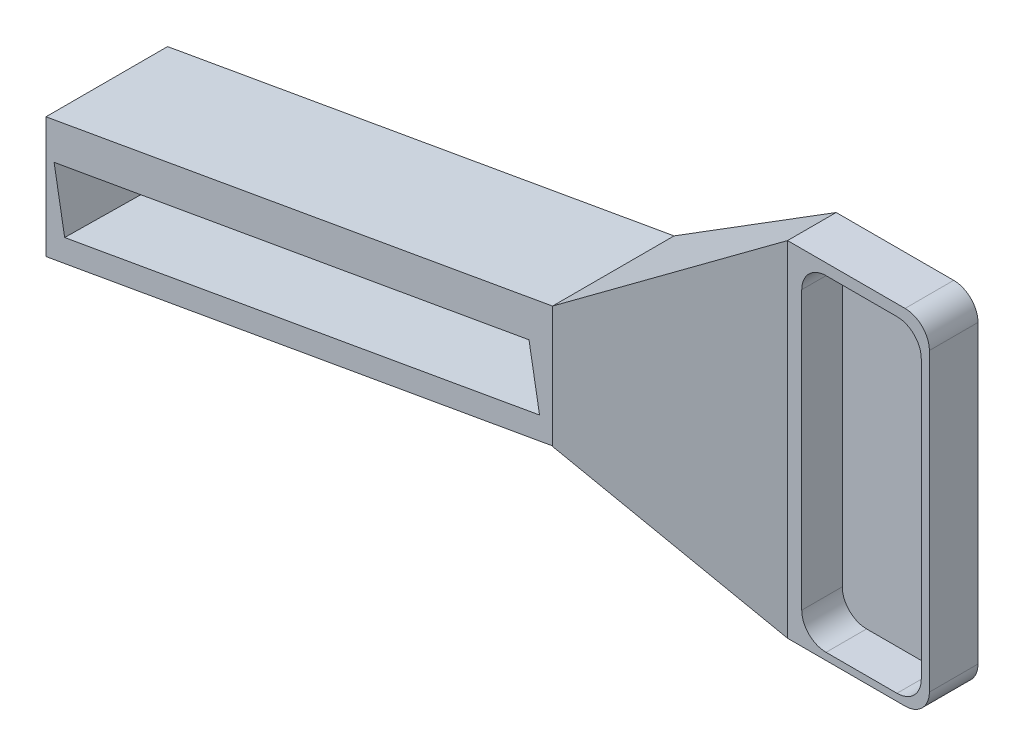
ISO-10303-21;
HEADER;
FILE_DESCRIPTION(('STEP AP214'),'2;1');
FILE_NAME('part.step','',(''),(''),'','','');
FILE_SCHEMA(('AUTOMOTIVE_DESIGN { 1 0 10303 214 1 1 1 1 }'));
ENDSEC;
DATA;
#1=APPLICATION_CONTEXT('core data for automotive mechanical design processes');
#2=APPLICATION_PROTOCOL_DEFINITION('international standard','automotive_design',2000,#1);
#3=PRODUCT_CONTEXT('',#1,'mechanical');
#4=PRODUCT('Part','Part','',(#3));
#5=PRODUCT_RELATED_PRODUCT_CATEGORY('part','',(#4));
#6=PRODUCT_DEFINITION_FORMATION('','',#4);
#7=PRODUCT_DEFINITION_CONTEXT('part definition',#1,'design');
#8=PRODUCT_DEFINITION('design','',#6,#7);
#9=PRODUCT_DEFINITION_SHAPE('','',#8);
#10=(LENGTH_UNIT() NAMED_UNIT(*) SI_UNIT(.MILLI.,.METRE.));
#11=(NAMED_UNIT(*) PLANE_ANGLE_UNIT() SI_UNIT($,.RADIAN.));
#12=(NAMED_UNIT(*) SI_UNIT($,.STERADIAN.) SOLID_ANGLE_UNIT());
#13=UNCERTAINTY_MEASURE_WITH_UNIT(LENGTH_MEASURE(1.E-05),#10,'distance_accuracy_value','');
#14=(GEOMETRIC_REPRESENTATION_CONTEXT(3) GLOBAL_UNCERTAINTY_ASSIGNED_CONTEXT((#13)) GLOBAL_UNIT_ASSIGNED_CONTEXT((#10,
#11,#12)) REPRESENTATION_CONTEXT('',''));
#15=CARTESIAN_POINT('',(0.,0.,0.));
#16=DIRECTION('',(0.,0.,1.));
#17=DIRECTION('',(1.,0.,0.));
#18=AXIS2_PLACEMENT_3D('',#15,#16,#17);
#19=CARTESIAN_POINT('',(0.,85.,30.));
#20=DIRECTION('',(0.,0.,-1.));
#21=DIRECTION('',(-1.,0.,0.));
#22=AXIS2_PLACEMENT_3D('',#19,#20,#21);
#23=PLANE('',#22);
#24=DIRECTION('',(0.173648177666931,-0.984807753012208,0.));
#25=VECTOR('',#24,1.);
#26=CARTESIAN_POINT('',(148.645542453034,-117.152586342547,30.));
#27=LINE('',#26,#25);
#28=CARTESIAN_POINT('',(119.192122608453,49.8860581475916,30.));
#29=VERTEX_POINT('',#28);
#30=CARTESIAN_POINT('',(121.796845273457,35.1139418524085,30.));
#31=VERTEX_POINT('',#30);
#32=EDGE_CURVE('E374',#29,#31,#27,.T.);
#33=ORIENTED_EDGE('',*,*,#32,.T.);
#34=DIRECTION('',(0.984807753012208,0.173648177666931,0.));
#35=VECTOR('',#34,1.);
#36=CARTESIAN_POINT('',(73.151302820423,26.5364202267395,30.));
#37=LINE('',#36,#35);
#38=CARTESIAN_POINT('',(4.60472266500394,14.4498087100436,30.));
#39=VERTEX_POINT('',#38);
#40=EDGE_CURVE('E382',#39,#31,#37,.T.);
#41=ORIENTED_EDGE('',*,*,#40,.F.);
#42=DIRECTION('',(0.173648177666931,-0.984807753012208,0.));
#43=VECTOR('',#42,1.);
#44=CARTESIAN_POINT('',(31.4534198445809,-137.816719484912,30.));
#45=LINE('',#44,#43);
#46=CARTESIAN_POINT('',(1.99999999999997,29.2219250052268,30.));
#47=VERTEX_POINT('',#46);
#48=EDGE_CURVE('E380',#47,#39,#45,.T.);
#49=ORIENTED_EDGE('',*,*,#48,.F.);
#50=DIRECTION('',(0.984807753012208,0.173648177666931,0.));
#51=VECTOR('',#50,1.);
#52=CARTESIAN_POINT('',(70.5465801554191,41.3085365219227,30.));
#53=LINE('',#52,#51);
#54=EDGE_CURVE('E377',#47,#29,#53,.T.);
#55=ORIENTED_EDGE('',*,*,#54,.T.);
#56=EDGE_LOOP('',(#33,#41,#49,#55));
#57=FACE_BOUND('',#56,.T.);
#58=DIRECTION('',(0.984807753012208,0.173648177666931,0.));
#59=VECTOR('',#58,1.);
#60=CARTESIAN_POINT('',(45.8978941203874,16.166106354975,30.));
#61=LINE('',#60,#59);
#62=CARTESIAN_POINT('',(0.,8.07306926385028,30.));
#63=VERTEX_POINT('',#62);
#64=CARTESIAN_POINT('',(125.,30.1139418524085,30.));
#65=VERTEX_POINT('',#64);
#66=EDGE_CURVE('E309',#63,#65,#61,.T.);
#67=ORIENTED_EDGE('',*,*,#66,.T.);
#68=DIRECTION('',(0.,1.,0.));
#69=VECTOR('',#68,1.);
#70=CARTESIAN_POINT('',(125.,85.,30.));
#71=LINE('',#70,#69);
#72=CARTESIAN_POINT('',(125.,60.,30.));
#73=VERTEX_POINT('',#72);
#74=EDGE_CURVE('E393',#65,#73,#71,.T.);
#75=ORIENTED_EDGE('',*,*,#74,.T.);
#76=DIRECTION('',(-0.984807753012207,-0.173648177666938,0.));
#77=VECTOR('',#76,1.);
#78=CARTESIAN_POINT('',(41.2609670724875,45.2345491564444,30.));
#79=LINE('',#78,#77);
#80=CARTESIAN_POINT('',(0.,37.9591274114409,30.));
#81=VERTEX_POINT('',#80);
#82=EDGE_CURVE('E327',#73,#81,#79,.T.);
#83=ORIENTED_EDGE('',*,*,#82,.T.);
#84=DIRECTION('',(0.,-1.,0.));
#85=VECTOR('',#84,1.);
#86=CARTESIAN_POINT('',(0.,0.,30.));
#87=LINE('',#86,#85);
#88=EDGE_CURVE('E390',#81,#63,#87,.T.);
#89=ORIENTED_EDGE('',*,*,#88,.T.);
#90=EDGE_LOOP('',(#67,#75,#83,#89));
#91=FACE_BOUND('',#90,.T.);
#92=ADVANCED_FACE('F35',(#57,#91),#23,.F.);
#93=CARTESIAN_POINT('',(0.,0.,30.));
#94=DIRECTION('',(1.,0.,0.));
#95=DIRECTION('',(0.,0.,-1.));
#96=AXIS2_PLACEMENT_3D('',#93,#94,#95);
#97=PLANE('',#96);
#98=DIRECTION('',(0.,0.,1.));
#99=VECTOR('',#98,1.);
#100=CARTESIAN_POINT('',(0.,8.07306926385028,0.));
#101=LINE('',#100,#99);
#102=CARTESIAN_POINT('',(0.,8.07306926385028,0.));
#103=VERTEX_POINT('',#102);
#104=EDGE_CURVE('E321',#103,#63,#101,.T.);
#105=ORIENTED_EDGE('',*,*,#104,.T.);
#106=ORIENTED_EDGE('',*,*,#88,.F.);
#107=DIRECTION('',(0.,0.,1.));
#108=VECTOR('',#107,1.);
#109=CARTESIAN_POINT('',(0.,37.9591274114409,0.));
#110=LINE('',#109,#108);
#111=CARTESIAN_POINT('',(0.,37.9591274114409,0.));
#112=VERTEX_POINT('',#111);
#113=EDGE_CURVE('E335',#112,#81,#110,.T.);
#114=ORIENTED_EDGE('',*,*,#113,.F.);
#115=DIRECTION('',(0.,-1.,0.));
#116=VECTOR('',#115,1.);
#117=CARTESIAN_POINT('',(0.,0.,0.));
#118=LINE('',#117,#116);
#119=EDGE_CURVE('E388',#112,#103,#118,.T.);
#120=ORIENTED_EDGE('',*,*,#119,.T.);
#121=EDGE_LOOP('',(#105,#106,#114,#120));
#122=FACE_BOUND('',#121,.T.);
#123=ADVANCED_FACE('F515',(#122),#97,.F.);
#124=CARTESIAN_POINT('',(0.,85.,0.));
#125=DIRECTION('',(0.,0.,-1.));
#126=DIRECTION('',(-1.,0.,0.));
#127=AXIS2_PLACEMENT_3D('',#124,#125,#126);
#128=PLANE('',#127);
#129=DIRECTION('',(-0.173648177666932,0.984807753012208,0.));
#130=VECTOR('',#129,1.);
#131=CARTESIAN_POINT('',(4.99999999999999,10.9855573911641,0.));
#132=LINE('',#131,#130);
#133=CARTESIAN_POINT('',(4.99999999999999,10.9855573911641,0.));
#134=VERTEX_POINT('',#133);
#135=CARTESIAN_POINT('',(4.65270364466613,12.9551728971885,0.));
#136=VERTEX_POINT('',#135);
#137=EDGE_CURVE('E246',#134,#136,#132,.T.);
#138=ORIENTED_EDGE('',*,*,#137,.F.);
#139=DIRECTION('',(-0.984807753012208,-0.173648177666931,0.));
#140=VECTOR('',#139,1.);
#141=CARTESIAN_POINT('',(4.99999999999999,10.9855573911641,0.));
#142=LINE('',#141,#140);
#143=CARTESIAN_POINT('',(44.3923101204883,17.9314844978413,0.));
#144=VERTEX_POINT('',#143);
#145=EDGE_CURVE('E266',#144,#134,#142,.T.);
#146=ORIENTED_EDGE('',*,*,#145,.F.);
#147=DIRECTION('',(0.173648177666932,-0.984807753012208,0.));
#148=VECTOR('',#147,1.);
#149=CARTESIAN_POINT('',(44.3923101204883,17.9314844978413,0.));
#150=LINE('',#149,#148);
#151=CARTESIAN_POINT('',(44.0450137651545,19.9011000038658,0.));
#152=VERTEX_POINT('',#151);
#153=EDGE_CURVE('E269',#152,#144,#150,.T.);
#154=ORIENTED_EDGE('',*,*,#153,.F.);
#155=DIRECTION('',(0.984807753012208,0.173648177666931,0.));
#156=VECTOR('',#155,1.);
#157=CARTESIAN_POINT('',(4.65270364466613,12.9551728971885,0.));
#158=LINE('',#157,#156);
#159=EDGE_CURVE('E275',#136,#152,#158,.T.);
#160=ORIENTED_EDGE('',*,*,#159,.F.);
#161=EDGE_LOOP('',(#138,#146,#154,#160));
#162=FACE_BOUND('',#161,.T.);
#163=DIRECTION('',(-1.,0.,0.));
#164=VECTOR('',#163,1.);
#165=CARTESIAN_POINT('',(0.,85.,0.));
#166=LINE('',#165,#164);
#167=CARTESIAN_POINT('',(194.,85.,0.));
#168=VERTEX_POINT('',#167);
#169=CARTESIAN_POINT('',(165.,85.,0.));
#170=VERTEX_POINT('',#169);
#171=EDGE_CURVE('E394',#168,#170,#166,.T.);
#172=ORIENTED_EDGE('',*,*,#171,.F.);
#173=CARTESIAN_POINT('',(194.,79.,0.));
#174=DIRECTION('',(0.,0.,-1.));
#175=DIRECTION('',(-1.,0.,0.));
#176=AXIS2_PLACEMENT_3D('',#173,#174,#175);
#177=CIRCLE('',#176,6.);
#178=CARTESIAN_POINT('',(200.,79.,0.));
#179=VERTEX_POINT('',#178);
#180=EDGE_CURVE('E464',#168,#179,#177,.T.);
#181=ORIENTED_EDGE('',*,*,#180,.T.);
#182=DIRECTION('',(0.,1.,0.));
#183=VECTOR('',#182,1.);
#184=CARTESIAN_POINT('',(200.,0.,0.));
#185=LINE('',#184,#183);
#186=CARTESIAN_POINT('',(200.,6.,0.));
#187=VERTEX_POINT('',#186);
#188=EDGE_CURVE('E400',#187,#179,#185,.T.);
#189=ORIENTED_EDGE('',*,*,#188,.F.);
#190=CARTESIAN_POINT('',(194.,6.,0.));
#191=DIRECTION('',(0.,0.,-1.));
#192=DIRECTION('',(-1.,0.,0.));
#193=AXIS2_PLACEMENT_3D('',#190,#191,#192);
#194=CIRCLE('',#193,6.);
#195=CARTESIAN_POINT('',(194.,0.,0.));
#196=VERTEX_POINT('',#195);
#197=EDGE_CURVE('E462',#187,#196,#194,.T.);
#198=ORIENTED_EDGE('',*,*,#197,.T.);
#199=DIRECTION('',(1.,0.,0.));
#200=VECTOR('',#199,1.);
#201=CARTESIAN_POINT('',(0.,0.,0.));
#202=LINE('',#201,#200);
#203=CARTESIAN_POINT('',(165.,0.,0.));
#204=VERTEX_POINT('',#203);
#205=EDGE_CURVE('E397',#204,#196,#202,.T.);
#206=ORIENTED_EDGE('',*,*,#205,.F.);
#207=DIRECTION('',(0.8,-0.6,0.));
#208=VECTOR('',#207,1.);
#209=CARTESIAN_POINT('',(18.5999999999999,109.8,0.));
#210=LINE('',#209,#208);
#211=CARTESIAN_POINT('',(125.,30.,0.));
#212=VERTEX_POINT('',#211);
#213=EDGE_CURVE('E413',#204,#212,#210,.F.);
#214=ORIENTED_EDGE('',*,*,#213,.T.);
#215=DIRECTION('',(0.,1.,0.));
#216=VECTOR('',#215,1.);
#217=CARTESIAN_POINT('',(125.,-77.9891148874388,0.));
#218=LINE('',#217,#216);
#219=CARTESIAN_POINT('',(125.,30.1139418524085,0.));
#220=VERTEX_POINT('',#219);
#221=EDGE_CURVE('E319',#212,#220,#218,.T.);
#222=ORIENTED_EDGE('',*,*,#221,.T.);
#223=DIRECTION('',(0.984807753012208,0.173648177666931,0.));
#224=VECTOR('',#223,1.);
#225=CARTESIAN_POINT('',(45.8978941203874,16.166106354975,0.));
#226=LINE('',#225,#224);
#227=EDGE_CURVE('E316',#103,#220,#226,.T.);
#228=ORIENTED_EDGE('',*,*,#227,.F.);
#229=ORIENTED_EDGE('',*,*,#119,.F.);
#230=DIRECTION('',(-0.984807753012207,-0.173648177666938,0.));
#231=VECTOR('',#230,1.);
#232=CARTESIAN_POINT('',(41.2609670724875,45.2345491564444,0.));
#233=LINE('',#232,#231);
#234=CARTESIAN_POINT('',(125.,60.,0.));
#235=VERTEX_POINT('',#234);
#236=EDGE_CURVE('E330',#235,#112,#233,.T.);
#237=ORIENTED_EDGE('',*,*,#236,.F.);
#238=DIRECTION('',(-0.847998304005088,-0.52999894000318,0.));
#239=VECTOR('',#238,1.);
#240=CARTESIAN_POINT('',(46.3483146067415,10.8426966292136,0.));
#241=LINE('',#240,#239);
#242=EDGE_CURVE('E420',#235,#170,#241,.F.);
#243=ORIENTED_EDGE('',*,*,#242,.T.);
#244=EDGE_LOOP('',(#172,#181,#189,#198,#206,#214,#222,#228,#229,#237,#243));
#245=FACE_BOUND('',#244,.T.);
#246=ADVANCED_FACE('F519',(#162,#245),#128,.T.);
#247=CARTESIAN_POINT('',(0.,0.,30.));
#248=DIRECTION('',(0.,1.,0.));
#249=DIRECTION('',(0.,0.,1.));
#250=AXIS2_PLACEMENT_3D('',#247,#248,#249);
#251=PLANE('',#250);
#252=ORIENTED_EDGE('',*,*,#205,.T.);
#253=DIRECTION('',(0.,0.,-1.));
#254=VECTOR('',#253,1.);
#255=CARTESIAN_POINT('',(194.,0.,30.));
#256=LINE('',#255,#254);
#257=CARTESIAN_POINT('',(194.,0.,12.));
#258=VERTEX_POINT('',#257);
#259=EDGE_CURVE('E475',#196,#258,#256,.F.);
#260=ORIENTED_EDGE('',*,*,#259,.T.);
#261=DIRECTION('',(1.,0.,0.));
#262=VECTOR('',#261,1.);
#263=CARTESIAN_POINT('',(200.,0.,12.));
#264=LINE('',#263,#262);
#265=CARTESIAN_POINT('',(165.,0.,12.));
#266=VERTEX_POINT('',#265);
#267=EDGE_CURVE('E371',#266,#258,#264,.T.);
#268=ORIENTED_EDGE('',*,*,#267,.F.);
#269=DIRECTION('',(0.,0.,-1.));
#270=VECTOR('',#269,1.);
#271=CARTESIAN_POINT('',(165.,0.,30.));
#272=LINE('',#271,#270);
#273=EDGE_CURVE('E411',#266,#204,#272,.T.);
#274=ORIENTED_EDGE('',*,*,#273,.T.);
#275=EDGE_LOOP('',(#252,#260,#268,#274));
#276=FACE_BOUND('',#275,.T.);
#277=ADVANCED_FACE('F524',(#276),#251,.F.);
#278=CARTESIAN_POINT('',(200.,0.,30.));
#279=DIRECTION('',(-1.,0.,0.));
#280=DIRECTION('',(0.,0.,1.));
#281=AXIS2_PLACEMENT_3D('',#278,#279,#280);
#282=PLANE('',#281);
#283=ORIENTED_EDGE('',*,*,#188,.T.);
#284=DIRECTION('',(0.,0.,-1.));
#285=VECTOR('',#284,1.);
#286=CARTESIAN_POINT('',(200.,79.,30.));
#287=LINE('',#286,#285);
#288=CARTESIAN_POINT('',(200.,79.,12.));
#289=VERTEX_POINT('',#288);
#290=EDGE_CURVE('E469',#179,#289,#287,.F.);
#291=ORIENTED_EDGE('',*,*,#290,.T.);
#292=DIRECTION('',(0.,1.,0.));
#293=VECTOR('',#292,1.);
#294=CARTESIAN_POINT('',(200.,85.,12.));
#295=LINE('',#294,#293);
#296=CARTESIAN_POINT('',(200.,6.00000000000001,12.));
#297=VERTEX_POINT('',#296);
#298=EDGE_CURVE('E353',#297,#289,#295,.T.);
#299=ORIENTED_EDGE('',*,*,#298,.F.);
#300=DIRECTION('',(0.,0.,-1.));
#301=VECTOR('',#300,1.);
#302=CARTESIAN_POINT('',(200.,6.,30.));
#303=LINE('',#302,#301);
#304=EDGE_CURVE('E466',#297,#187,#303,.T.);
#305=ORIENTED_EDGE('',*,*,#304,.T.);
#306=EDGE_LOOP('',(#283,#291,#299,#305));
#307=FACE_BOUND('',#306,.T.);
#308=ADVANCED_FACE('F509',(#307),#282,.F.);
#309=CARTESIAN_POINT('',(0.,85.,30.));
#310=DIRECTION('',(0.,-1.,0.));
#311=DIRECTION('',(0.,0.,-1.));
#312=AXIS2_PLACEMENT_3D('',#309,#310,#311);
#313=PLANE('',#312);
#314=DIRECTION('',(-1.,0.,0.));
#315=VECTOR('',#314,1.);
#316=CARTESIAN_POINT('',(200.,85.,12.));
#317=LINE('',#316,#315);
#318=CARTESIAN_POINT('',(194.,85.,12.));
#319=VERTEX_POINT('',#318);
#320=CARTESIAN_POINT('',(165.,85.,12.));
#321=VERTEX_POINT('',#320);
#322=EDGE_CURVE('E366',#319,#321,#317,.T.);
#323=ORIENTED_EDGE('',*,*,#322,.F.);
#324=DIRECTION('',(0.,0.,-1.));
#325=VECTOR('',#324,1.);
#326=CARTESIAN_POINT('',(194.,85.,30.));
#327=LINE('',#326,#325);
#328=EDGE_CURVE('E459',#319,#168,#327,.T.);
#329=ORIENTED_EDGE('',*,*,#328,.T.);
#330=ORIENTED_EDGE('',*,*,#171,.T.);
#331=DIRECTION('',(0.,0.,1.));
#332=VECTOR('',#331,1.);
#333=CARTESIAN_POINT('',(165.,85.,30.));
#334=LINE('',#333,#332);
#335=EDGE_CURVE('E415',#170,#321,#334,.T.);
#336=ORIENTED_EDGE('',*,*,#335,.T.);
#337=EDGE_LOOP('',(#323,#329,#330,#336));
#338=FACE_BOUND('',#337,.T.);
#339=ADVANCED_FACE('F502',(#338),#313,.F.);
#340=CARTESIAN_POINT('',(148.645542453034,-117.152586342547,2.));
#341=DIRECTION('',(-0.984807753012208,-0.173648177666931,0.));
#342=DIRECTION('',(0.173648177666931,-0.984807753012208,0.));
#343=AXIS2_PLACEMENT_3D('',#340,#341,#342);
#344=PLANE('',#343);
#345=DIRECTION('',(0.,0.,1.));
#346=VECTOR('',#345,1.);
#347=CARTESIAN_POINT('',(119.192122608453,49.8860581475916,2.));
#348=LINE('',#347,#346);
#349=CARTESIAN_POINT('',(119.192122608453,49.8860581475916,4.));
#350=VERTEX_POINT('',#349);
#351=EDGE_CURVE('E385',#350,#29,#348,.T.);
#352=ORIENTED_EDGE('',*,*,#351,.F.);
#353=DIRECTION('',(0.173648177666931,-0.984807753012208,0.));
#354=VECTOR('',#353,1.);
#355=CARTESIAN_POINT('',(121.796845273457,35.1139418524085,4.));
#356=LINE('',#355,#354);
#357=CARTESIAN_POINT('',(121.796845273457,35.1139418524085,4.));
#358=VERTEX_POINT('',#357);
#359=EDGE_CURVE('E477',#350,#358,#356,.T.);
#360=ORIENTED_EDGE('',*,*,#359,.T.);
#361=DIRECTION('',(0.,0.,1.));
#362=VECTOR('',#361,1.);
#363=CARTESIAN_POINT('',(121.796845273457,35.1139418524085,2.));
#364=LINE('',#363,#362);
#365=EDGE_CURVE('E386',#358,#31,#364,.T.);
#366=ORIENTED_EDGE('',*,*,#365,.T.);
#367=ORIENTED_EDGE('',*,*,#32,.F.);
#368=EDGE_LOOP('',(#352,#360,#366,#367));
#369=FACE_BOUND('',#368,.T.);
#370=ADVANCED_FACE('F500',(#369),#344,.T.);
#371=CARTESIAN_POINT('',(73.151302820423,26.5364202267395,2.));
#372=DIRECTION('',(0.173648177666931,-0.984807753012208,0.));
#373=DIRECTION('',(0.984807753012208,0.173648177666931,0.));
#374=AXIS2_PLACEMENT_3D('',#371,#372,#373);
#375=PLANE('',#374);
#376=DIRECTION('',(0.98466869515314,0.173623658014498,0.0168043495285633));
#377=VECTOR('',#376,1.);
#378=CARTESIAN_POINT('',(121.796845273457,35.1139418524085,4.));
#379=LINE('',#378,#377);
#380=CARTESIAN_POINT('',(5.06751695172591,14.5314118293105,2.00789804427801));
#381=VERTEX_POINT('',#380);
#382=EDGE_CURVE('E480',#358,#381,#379,.F.);
#383=ORIENTED_EDGE('',*,*,#382,.T.);
#384=DIRECTION('',(-0.0165307015655505,-0.00291480869604622,0.999859109973008));
#385=VECTOR('',#384,1.);
#386=CARTESIAN_POINT('',(5.0675169517259,14.5314118293105,2.00789804427801));
#387=LINE('',#386,#385);
#388=EDGE_CURVE('E43',#381,#39,#387,.T.);
#389=ORIENTED_EDGE('',*,*,#388,.T.);
#390=ORIENTED_EDGE('',*,*,#40,.T.);
#391=ORIENTED_EDGE('',*,*,#365,.F.);
#392=EDGE_LOOP('',(#383,#389,#390,#391));
#393=FACE_BOUND('',#392,.T.);
#394=ADVANCED_FACE('F488',(#393),#375,.F.);
#395=CARTESIAN_POINT('',(70.5465801554191,41.3085365219227,2.));
#396=DIRECTION('',(0.173648177666931,-0.984807753012208,0.));
#397=DIRECTION('',(0.984807753012208,0.173648177666931,0.));
#398=AXIS2_PLACEMENT_3D('',#395,#396,#397);
#399=PLANE('',#398);
#400=ORIENTED_EDGE('',*,*,#54,.F.);
#401=DIRECTION('',(0.0165307015655505,0.00291480869604622,-0.999859109973008));
#402=VECTOR('',#401,1.);
#403=CARTESIAN_POINT('',(2.48210812993455,29.3069336761532,0.839700674785365));
#404=LINE('',#403,#402);
#405=CARTESIAN_POINT('',(2.46279428672192,29.3035281244937,2.00789804427801));
#406=VERTEX_POINT('',#405);
#407=EDGE_CURVE('E11',#47,#406,#404,.T.);
#408=ORIENTED_EDGE('',*,*,#407,.T.);
#409=DIRECTION('',(-0.98466869515314,-0.173623658014498,-0.0168043495285633));
#410=VECTOR('',#409,1.);
#411=CARTESIAN_POINT('',(70.5272235496569,41.3051234300719,3.16948515010008));
#412=LINE('',#411,#410);
#413=EDGE_CURVE('E483',#406,#350,#412,.F.);
#414=ORIENTED_EDGE('',*,*,#413,.T.);
#415=ORIENTED_EDGE('',*,*,#351,.T.);
#416=EDGE_LOOP('',(#400,#408,#414,#415));
#417=FACE_BOUND('',#416,.T.);
#418=ADVANCED_FACE('F498',(#417),#399,.T.);
#419=CARTESIAN_POINT('',(200.,0.,12.));
#420=DIRECTION('',(0.,0.,-1.));
#421=DIRECTION('',(-1.,0.,0.));
#422=AXIS2_PLACEMENT_3D('',#419,#420,#421);
#423=PLANE('',#422);
#424=DIRECTION('',(-1.,0.,0.));
#425=VECTOR('',#424,1.);
#426=CARTESIAN_POINT('',(198.,82.25,12.));
#427=LINE('',#426,#425);
#428=CARTESIAN_POINT('',(192.,82.25,12.));
#429=VERTEX_POINT('',#428);
#430=CARTESIAN_POINT('',(174.5,82.25,12.));
#431=VERTEX_POINT('',#430);
#432=EDGE_CURVE('E356',#429,#431,#427,.T.);
#433=ORIENTED_EDGE('',*,*,#432,.F.);
#434=CARTESIAN_POINT('',(192.,76.25,12.));
#435=DIRECTION('',(0.,0.,-1.));
#436=DIRECTION('',(-1.,0.,0.));
#437=AXIS2_PLACEMENT_3D('',#434,#435,#436);
#438=CIRCLE('',#437,6.);
#439=CARTESIAN_POINT('',(198.,76.25,12.));
#440=VERTEX_POINT('',#439);
#441=EDGE_CURVE('E455',#429,#440,#438,.T.);
#442=ORIENTED_EDGE('',*,*,#441,.T.);
#443=DIRECTION('',(0.,1.,0.));
#444=VECTOR('',#443,1.);
#445=CARTESIAN_POINT('',(198.,82.25,12.));
#446=LINE('',#445,#444);
#447=CARTESIAN_POINT('',(198.,7.74999999999999,12.));
#448=VERTEX_POINT('',#447);
#449=EDGE_CURVE('E337',#448,#440,#446,.T.);
#450=ORIENTED_EDGE('',*,*,#449,.F.);
#451=CARTESIAN_POINT('',(192.,7.74999999999999,12.));
#452=DIRECTION('',(0.,0.,-1.));
#453=DIRECTION('',(-1.,0.,0.));
#454=AXIS2_PLACEMENT_3D('',#451,#452,#453);
#455=CIRCLE('',#454,6.);
#456=CARTESIAN_POINT('',(192.,1.75,12.));
#457=VERTEX_POINT('',#456);
#458=EDGE_CURVE('E451',#448,#457,#455,.T.);
#459=ORIENTED_EDGE('',*,*,#458,.T.);
#460=DIRECTION('',(1.,0.,0.));
#461=VECTOR('',#460,1.);
#462=CARTESIAN_POINT('',(198.,1.75,12.));
#463=LINE('',#462,#461);
#464=CARTESIAN_POINT('',(174.5,1.75,12.));
#465=VERTEX_POINT('',#464);
#466=EDGE_CURVE('E344',#465,#457,#463,.T.);
#467=ORIENTED_EDGE('',*,*,#466,.F.);
#468=CARTESIAN_POINT('',(174.5,7.75,12.));
#469=DIRECTION('',(0.,0.,-1.));
#470=DIRECTION('',(-1.,0.,0.));
#471=AXIS2_PLACEMENT_3D('',#468,#469,#470);
#472=CIRCLE('',#471,6.);
#473=CARTESIAN_POINT('',(168.5,7.75000000000001,12.));
#474=VERTEX_POINT('',#473);
#475=EDGE_CURVE('E453',#465,#474,#472,.T.);
#476=ORIENTED_EDGE('',*,*,#475,.T.);
#477=DIRECTION('',(0.,-1.,0.));
#478=VECTOR('',#477,1.);
#479=CARTESIAN_POINT('',(168.5,82.25,12.));
#480=LINE('',#479,#478);
#481=CARTESIAN_POINT('',(168.5,76.25,12.));
#482=VERTEX_POINT('',#481);
#483=EDGE_CURVE('E359',#482,#474,#480,.T.);
#484=ORIENTED_EDGE('',*,*,#483,.F.);
#485=CARTESIAN_POINT('',(174.5,76.25,12.));
#486=DIRECTION('',(0.,0.,-1.));
#487=DIRECTION('',(-1.,0.,0.));
#488=AXIS2_PLACEMENT_3D('',#485,#486,#487);
#489=CIRCLE('',#488,6.);
#490=EDGE_CURVE('E457',#482,#431,#489,.T.);
#491=ORIENTED_EDGE('',*,*,#490,.T.);
#492=EDGE_LOOP('',(#433,#442,#450,#459,#467,#476,#484,#491));
#493=FACE_BOUND('',#492,.T.);
#494=ORIENTED_EDGE('',*,*,#298,.T.);
#495=CARTESIAN_POINT('',(194.,79.,12.));
#496=DIRECTION('',(0.,0.,-1.));
#497=DIRECTION('',(-1.,0.,0.));
#498=AXIS2_PLACEMENT_3D('',#495,#496,#497);
#499=CIRCLE('',#498,6.);
#500=EDGE_CURVE('E473',#289,#319,#499,.F.);
#501=ORIENTED_EDGE('',*,*,#500,.T.);
#502=ORIENTED_EDGE('',*,*,#322,.T.);
#503=DIRECTION('',(0.,-1.,0.));
#504=VECTOR('',#503,1.);
#505=CARTESIAN_POINT('',(165.,85.,12.));
#506=LINE('',#505,#504);
#507=EDGE_CURVE('E368',#321,#266,#506,.T.);
#508=ORIENTED_EDGE('',*,*,#507,.T.);
#509=ORIENTED_EDGE('',*,*,#267,.T.);
#510=CARTESIAN_POINT('',(194.,6.,12.));
#511=DIRECTION('',(0.,0.,-1.));
#512=DIRECTION('',(-1.,0.,0.));
#513=AXIS2_PLACEMENT_3D('',#510,#511,#512);
#514=CIRCLE('',#513,6.);
#515=EDGE_CURVE('E471',#258,#297,#514,.F.);
#516=ORIENTED_EDGE('',*,*,#515,.T.);
#517=EDGE_LOOP('',(#494,#501,#502,#508,#509,#516));
#518=FACE_BOUND('',#517,.T.);
#519=ADVANCED_FACE('F592',(#493,#518),#423,.F.);
#520=CARTESIAN_POINT('',(198.,82.25,2.));
#521=DIRECTION('',(1.,0.,0.));
#522=DIRECTION('',(0.,0.,-1.));
#523=AXIS2_PLACEMENT_3D('',#520,#521,#522);
#524=PLANE('',#523);
#525=DIRECTION('',(0.,1.,0.));
#526=VECTOR('',#525,1.);
#527=CARTESIAN_POINT('',(198.,82.25,2.));
#528=LINE('',#527,#526);
#529=CARTESIAN_POINT('',(198.,7.74999999999999,2.));
#530=VERTEX_POINT('',#529);
#531=CARTESIAN_POINT('',(198.,76.25,2.));
#532=VERTEX_POINT('',#531);
#533=EDGE_CURVE('E340',#530,#532,#528,.T.);
#534=ORIENTED_EDGE('',*,*,#533,.F.);
#535=DIRECTION('',(0.,0.,1.));
#536=VECTOR('',#535,1.);
#537=CARTESIAN_POINT('',(198.,7.74999999999999,12.));
#538=LINE('',#537,#536);
#539=EDGE_CURVE('E425',#530,#448,#538,.T.);
#540=ORIENTED_EDGE('',*,*,#539,.T.);
#541=ORIENTED_EDGE('',*,*,#449,.T.);
#542=DIRECTION('',(0.,0.,1.));
#543=VECTOR('',#542,1.);
#544=CARTESIAN_POINT('',(198.,76.25,2.));
#545=LINE('',#544,#543);
#546=EDGE_CURVE('E423',#440,#532,#545,.F.);
#547=ORIENTED_EDGE('',*,*,#546,.T.);
#548=EDGE_LOOP('',(#534,#540,#541,#547));
#549=FACE_BOUND('',#548,.T.);
#550=ADVANCED_FACE('F629',(#549),#524,.F.);
#551=CARTESIAN_POINT('',(198.,1.75,2.));
#552=DIRECTION('',(0.,-1.,0.));
#553=DIRECTION('',(1.,0.,0.));
#554=AXIS2_PLACEMENT_3D('',#551,#552,#553);
#555=PLANE('',#554);
#556=ORIENTED_EDGE('',*,*,#466,.T.);
#557=DIRECTION('',(0.,0.,1.));
#558=VECTOR('',#557,1.);
#559=CARTESIAN_POINT('',(192.,1.75,2.));
#560=LINE('',#559,#558);
#561=CARTESIAN_POINT('',(192.,1.75,2.));
#562=VERTEX_POINT('',#561);
#563=EDGE_CURVE('E431',#457,#562,#560,.F.);
#564=ORIENTED_EDGE('',*,*,#563,.T.);
#565=DIRECTION('',(1.,0.,0.));
#566=VECTOR('',#565,1.);
#567=CARTESIAN_POINT('',(198.,1.75,2.));
#568=LINE('',#567,#566);
#569=CARTESIAN_POINT('',(174.5,1.75,2.));
#570=VERTEX_POINT('',#569);
#571=EDGE_CURVE('E350',#570,#562,#568,.T.);
#572=ORIENTED_EDGE('',*,*,#571,.F.);
#573=DIRECTION('',(0.,0.,1.));
#574=VECTOR('',#573,1.);
#575=CARTESIAN_POINT('',(174.5,1.75,12.));
#576=LINE('',#575,#574);
#577=EDGE_CURVE('E428',#570,#465,#576,.T.);
#578=ORIENTED_EDGE('',*,*,#577,.T.);
#579=EDGE_LOOP('',(#556,#564,#572,#578));
#580=FACE_BOUND('',#579,.T.);
#581=ADVANCED_FACE('F711',(#580),#555,.F.);
#582=CARTESIAN_POINT('',(168.5,82.25,2.));
#583=DIRECTION('',(-1.,0.,0.));
#584=DIRECTION('',(0.,0.,1.));
#585=AXIS2_PLACEMENT_3D('',#582,#583,#584);
#586=PLANE('',#585);
#587=ORIENTED_EDGE('',*,*,#483,.T.);
#588=DIRECTION('',(0.,0.,1.));
#589=VECTOR('',#588,1.);
#590=CARTESIAN_POINT('',(168.5,7.75,2.));
#591=LINE('',#590,#589);
#592=CARTESIAN_POINT('',(168.5,7.75000000000001,2.));
#593=VERTEX_POINT('',#592);
#594=EDGE_CURVE('E444',#474,#593,#591,.F.);
#595=ORIENTED_EDGE('',*,*,#594,.T.);
#596=DIRECTION('',(0.,-1.,0.));
#597=VECTOR('',#596,1.);
#598=CARTESIAN_POINT('',(168.5,82.25,2.));
#599=LINE('',#598,#597);
#600=CARTESIAN_POINT('',(168.5,76.25,2.));
#601=VERTEX_POINT('',#600);
#602=EDGE_CURVE('E347',#601,#593,#599,.T.);
#603=ORIENTED_EDGE('',*,*,#602,.F.);
#604=DIRECTION('',(0.,0.,1.));
#605=VECTOR('',#604,1.);
#606=CARTESIAN_POINT('',(168.5,76.25,12.));
#607=LINE('',#606,#605);
#608=EDGE_CURVE('E441',#601,#482,#607,.T.);
#609=ORIENTED_EDGE('',*,*,#608,.T.);
#610=EDGE_LOOP('',(#587,#595,#603,#609));
#611=FACE_BOUND('',#610,.T.);
#612=ADVANCED_FACE('F701',(#611),#586,.F.);
#613=CARTESIAN_POINT('',(198.,82.25,2.));
#614=DIRECTION('',(0.,1.,0.));
#615=DIRECTION('',(0.,0.,1.));
#616=AXIS2_PLACEMENT_3D('',#613,#614,#615);
#617=PLANE('',#616);
#618=DIRECTION('',(-1.,0.,0.));
#619=VECTOR('',#618,1.);
#620=CARTESIAN_POINT('',(198.,82.25,2.));
#621=LINE('',#620,#619);
#622=CARTESIAN_POINT('',(192.,82.25,2.));
#623=VERTEX_POINT('',#622);
#624=CARTESIAN_POINT('',(174.5,82.25,2.));
#625=VERTEX_POINT('',#624);
#626=EDGE_CURVE('E343',#623,#625,#621,.T.);
#627=ORIENTED_EDGE('',*,*,#626,.F.);
#628=DIRECTION('',(0.,0.,1.));
#629=VECTOR('',#628,1.);
#630=CARTESIAN_POINT('',(192.,82.25,12.));
#631=LINE('',#630,#629);
#632=EDGE_CURVE('E448',#623,#429,#631,.T.);
#633=ORIENTED_EDGE('',*,*,#632,.T.);
#634=ORIENTED_EDGE('',*,*,#432,.T.);
#635=DIRECTION('',(0.,0.,1.));
#636=VECTOR('',#635,1.);
#637=CARTESIAN_POINT('',(174.5,82.25,2.));
#638=LINE('',#637,#636);
#639=EDGE_CURVE('E446',#431,#625,#638,.F.);
#640=ORIENTED_EDGE('',*,*,#639,.T.);
#641=EDGE_LOOP('',(#627,#633,#634,#640));
#642=FACE_BOUND('',#641,.T.);
#643=ADVANCED_FACE('F690',(#642),#617,.F.);
#644=CARTESIAN_POINT('',(198.,1.75,2.));
#645=DIRECTION('',(0.,0.,-1.));
#646=DIRECTION('',(-1.,0.,0.));
#647=AXIS2_PLACEMENT_3D('',#644,#645,#646);
#648=PLANE('',#647);
#649=ORIENTED_EDGE('',*,*,#571,.T.);
#650=CARTESIAN_POINT('',(192.,7.74999999999999,2.));
#651=DIRECTION('',(0.,0.,-1.));
#652=DIRECTION('',(-1.,0.,0.));
#653=AXIS2_PLACEMENT_3D('',#650,#651,#652);
#654=CIRCLE('',#653,6.);
#655=EDGE_CURVE('E439',#562,#530,#654,.F.);
#656=ORIENTED_EDGE('',*,*,#655,.T.);
#657=ORIENTED_EDGE('',*,*,#533,.T.);
#658=CARTESIAN_POINT('',(192.,76.25,2.));
#659=DIRECTION('',(0.,0.,-1.));
#660=DIRECTION('',(-1.,0.,0.));
#661=AXIS2_PLACEMENT_3D('',#658,#659,#660);
#662=CIRCLE('',#661,6.);
#663=EDGE_CURVE('E435',#532,#623,#662,.F.);
#664=ORIENTED_EDGE('',*,*,#663,.T.);
#665=ORIENTED_EDGE('',*,*,#626,.T.);
#666=CARTESIAN_POINT('',(174.5,76.25,2.));
#667=DIRECTION('',(0.,0.,-1.));
#668=DIRECTION('',(-1.,0.,0.));
#669=AXIS2_PLACEMENT_3D('',#666,#667,#668);
#670=CIRCLE('',#669,6.);
#671=EDGE_CURVE('E433',#625,#601,#670,.F.);
#672=ORIENTED_EDGE('',*,*,#671,.T.);
#673=ORIENTED_EDGE('',*,*,#602,.T.);
#674=CARTESIAN_POINT('',(174.5,7.75,2.));
#675=DIRECTION('',(0.,0.,-1.));
#676=DIRECTION('',(-1.,0.,0.));
#677=AXIS2_PLACEMENT_3D('',#674,#675,#676);
#678=CIRCLE('',#677,6.);
#679=EDGE_CURVE('E437',#593,#570,#678,.F.);
#680=ORIENTED_EDGE('',*,*,#679,.T.);
#681=EDGE_LOOP('',(#649,#656,#657,#664,#665,#672,#673,#680));
#682=FACE_BOUND('',#681,.T.);
#683=ADVANCED_FACE('F537',(#682),#648,.F.);
#684=CARTESIAN_POINT('',(165.,85.,12.));
#685=DIRECTION('',(-0.410364677328796,0.,-0.911921505175107));
#686=DIRECTION('',(-0.911921505175107,0.,0.410364677328796));
#687=AXIS2_PLACEMENT_3D('',#684,#685,#686);
#688=PLANE('',#687);
#689=ORIENTED_EDGE('',*,*,#507,.F.);
#690=DIRECTION('',(-0.792273397339465,-0.495170873337166,0.356523028802757));
#691=VECTOR('',#690,1.);
#692=CARTESIAN_POINT('',(165.,85.0000000000001,12.));
#693=LINE('',#692,#691);
#694=EDGE_CURVE('E418',#321,#73,#693,.T.);
#695=ORIENTED_EDGE('',*,*,#694,.T.);
#696=ORIENTED_EDGE('',*,*,#74,.F.);
#697=CARTESIAN_POINT('',(125.,30.,30.));
#698=VERTEX_POINT('',#697);
#699=EDGE_CURVE('E404',#698,#65,#71,.T.);
#700=ORIENTED_EDGE('',*,*,#699,.F.);
#701=DIRECTION('',(0.752709929494982,-0.564532447121237,-0.33871946827274));
#702=VECTOR('',#701,1.);
#703=CARTESIAN_POINT('',(128.881019830028,27.0892351274786,28.2535410764872));
#704=LINE('',#703,#702);
#705=EDGE_CURVE('E409',#698,#266,#704,.T.);
#706=ORIENTED_EDGE('',*,*,#705,.T.);
#707=EDGE_LOOP('',(#689,#695,#696,#700,#706));
#708=FACE_BOUND('',#707,.T.);
#709=ADVANCED_FACE('F533',(#708),#688,.F.);
#710=CARTESIAN_POINT('',(41.2609670724875,45.2345491564444,0.));
#711=DIRECTION('',(-0.173648177666938,0.984807753012207,0.));
#712=DIRECTION('',(-0.984807753012207,-0.173648177666938,0.));
#713=AXIS2_PLACEMENT_3D('',#710,#711,#712);
#714=PLANE('',#713);
#715=ORIENTED_EDGE('',*,*,#82,.F.);
#716=DIRECTION('',(0.,0.,1.));
#717=VECTOR('',#716,1.);
#718=CARTESIAN_POINT('',(125.,60.,0.));
#719=LINE('',#718,#717);
#720=EDGE_CURVE('E332',#235,#73,#719,.T.);
#721=ORIENTED_EDGE('',*,*,#720,.F.);
#722=ORIENTED_EDGE('',*,*,#236,.T.);
#723=ORIENTED_EDGE('',*,*,#113,.T.);
#724=EDGE_LOOP('',(#715,#721,#722,#723));
#725=FACE_BOUND('',#724,.T.);
#726=ADVANCED_FACE('F536',(#725),#714,.T.);
#727=CARTESIAN_POINT('',(45.8978941203874,16.166106354975,0.));
#728=DIRECTION('',(0.173648177666931,-0.984807753012208,0.));
#729=DIRECTION('',(0.984807753012208,0.173648177666931,0.));
#730=AXIS2_PLACEMENT_3D('',#727,#728,#729);
#731=PLANE('',#730);
#732=DIRECTION('',(0.,0.,-1.));
#733=VECTOR('',#732,1.);
#734=CARTESIAN_POINT('',(4.92403876506104,8.94131015218493,2.));
#735=LINE('',#734,#733);
#736=CARTESIAN_POINT('',(4.92403876506104,8.94131015218493,4.));
#737=VERTEX_POINT('',#736);
#738=CARTESIAN_POINT('',(4.92403876506104,8.94131015218493,2.));
#739=VERTEX_POINT('',#738);
#740=EDGE_CURVE('E281',#737,#739,#735,.T.);
#741=ORIENTED_EDGE('',*,*,#740,.F.);
#742=DIRECTION('',(-0.984807753012208,-0.173648177666931,0.));
#743=VECTOR('',#742,1.);
#744=CARTESIAN_POINT('',(4.92403876506104,8.94131015218493,4.));
#745=LINE('',#744,#743);
#746=CARTESIAN_POINT('',(44.3163488855494,15.8872372588622,4.));
#747=VERTEX_POINT('',#746);
#748=EDGE_CURVE('E290',#747,#737,#745,.T.);
#749=ORIENTED_EDGE('',*,*,#748,.F.);
#750=DIRECTION('',(0.,0.,1.));
#751=VECTOR('',#750,1.);
#752=CARTESIAN_POINT('',(44.3163488855494,15.8872372588622,2.));
#753=LINE('',#752,#751);
#754=CARTESIAN_POINT('',(44.3163488855494,15.8872372588622,2.));
#755=VERTEX_POINT('',#754);
#756=EDGE_CURVE('E303',#755,#747,#753,.T.);
#757=ORIENTED_EDGE('',*,*,#756,.F.);
#758=DIRECTION('',(0.984807753012208,0.173648177666931,0.));
#759=VECTOR('',#758,1.);
#760=CARTESIAN_POINT('',(4.92403876506104,8.94131015218493,2.));
#761=LINE('',#760,#759);
#762=EDGE_CURVE('E300',#739,#755,#761,.T.);
#763=ORIENTED_EDGE('',*,*,#762,.F.);
#764=EDGE_LOOP('',(#741,#749,#757,#763));
#765=FACE_BOUND('',#764,.T.);
#766=ORIENTED_EDGE('',*,*,#66,.F.);
#767=ORIENTED_EDGE('',*,*,#104,.F.);
#768=ORIENTED_EDGE('',*,*,#227,.T.);
#769=DIRECTION('',(0.,0.,1.));
#770=VECTOR('',#769,1.);
#771=CARTESIAN_POINT('',(125.,30.1139418524085,0.));
#772=LINE('',#771,#770);
#773=EDGE_CURVE('E324',#220,#65,#772,.T.);
#774=ORIENTED_EDGE('',*,*,#773,.T.);
#775=EDGE_LOOP('',(#766,#767,#768,#774));
#776=FACE_BOUND('',#775,.T.);
#777=ADVANCED_FACE('F816',(#765,#776),#731,.T.);
#778=CARTESIAN_POINT('',(125.,-77.9891148874388,0.));
#779=DIRECTION('',(1.,0.,0.));
#780=DIRECTION('',(0.,0.,-1.));
#781=AXIS2_PLACEMENT_3D('',#778,#779,#780);
#782=PLANE('',#781);
#783=ORIENTED_EDGE('',*,*,#221,.F.);
#784=DIRECTION('',(0.,0.,1.));
#785=VECTOR('',#784,1.);
#786=CARTESIAN_POINT('',(125.,30.,0.));
#787=LINE('',#786,#785);
#788=EDGE_CURVE('E406',#212,#698,#787,.T.);
#789=ORIENTED_EDGE('',*,*,#788,.T.);
#790=ORIENTED_EDGE('',*,*,#699,.T.);
#791=ORIENTED_EDGE('',*,*,#773,.F.);
#792=EDGE_LOOP('',(#783,#789,#790,#791));
#793=FACE_BOUND('',#792,.T.);
#794=ADVANCED_FACE('F543',(#793),#782,.F.);
#795=CARTESIAN_POINT('',(125.,30.,0.));
#796=DIRECTION('',(0.6,0.8,0.));
#797=DIRECTION('',(-0.8,0.6,0.));
#798=AXIS2_PLACEMENT_3D('',#795,#796,#797);
#799=PLANE('',#798);
#800=ORIENTED_EDGE('',*,*,#213,.F.);
#801=ORIENTED_EDGE('',*,*,#273,.F.);
#802=ORIENTED_EDGE('',*,*,#705,.F.);
#803=ORIENTED_EDGE('',*,*,#788,.F.);
#804=EDGE_LOOP('',(#800,#801,#802,#803));
#805=FACE_BOUND('',#804,.T.);
#806=ADVANCED_FACE('F539',(#805),#799,.F.);
#807=CARTESIAN_POINT('',(165.,85.,30.));
#808=DIRECTION('',(0.52999894000318,-0.847998304005088,0.));
#809=DIRECTION('',(0.847998304005088,0.52999894000318,0.));
#810=AXIS2_PLACEMENT_3D('',#807,#808,#809);
#811=PLANE('',#810);
#812=ORIENTED_EDGE('',*,*,#242,.F.);
#813=ORIENTED_EDGE('',*,*,#720,.T.);
#814=ORIENTED_EDGE('',*,*,#694,.F.);
#815=ORIENTED_EDGE('',*,*,#335,.F.);
#816=EDGE_LOOP('',(#812,#813,#814,#815));
#817=FACE_BOUND('',#816,.T.);
#818=ADVANCED_FACE('F542',(#817),#811,.F.);
#819=CARTESIAN_POINT('',(4.57674240972718,10.9109256582093,2.));
#820=DIRECTION('',(-0.984807753012208,-0.173648177666931,0.));
#821=DIRECTION('',(0.173648177666931,-0.984807753012208,0.));
#822=AXIS2_PLACEMENT_3D('',#819,#820,#821);
#823=PLANE('',#822);
#824=ORIENTED_EDGE('',*,*,#740,.T.);
#825=DIRECTION('',(0.173648177666931,-0.984807753012208,0.));
#826=VECTOR('',#825,1.);
#827=CARTESIAN_POINT('',(4.57674240972718,10.9109256582093,2.));
#828=LINE('',#827,#826);
#829=CARTESIAN_POINT('',(4.57674240972718,10.9109256582093,2.));
#830=VERTEX_POINT('',#829);
#831=EDGE_CURVE('E298',#830,#739,#828,.T.);
#832=ORIENTED_EDGE('',*,*,#831,.F.);
#833=DIRECTION('',(0.,0.,-1.));
#834=VECTOR('',#833,1.);
#835=CARTESIAN_POINT('',(4.57674240972718,10.9109256582093,2.));
#836=LINE('',#835,#834);
#837=CARTESIAN_POINT('',(4.57674240972718,10.9109256582093,4.));
#838=VERTEX_POINT('',#837);
#839=EDGE_CURVE('E286',#838,#830,#836,.T.);
#840=ORIENTED_EDGE('',*,*,#839,.F.);
#841=DIRECTION('',(0.173648177666931,-0.984807753012208,0.));
#842=VECTOR('',#841,1.);
#843=CARTESIAN_POINT('',(4.57674240972718,10.9109256582093,4.));
#844=LINE('',#843,#842);
#845=EDGE_CURVE('E307',#838,#737,#844,.T.);
#846=ORIENTED_EDGE('',*,*,#845,.T.);
#847=EDGE_LOOP('',(#824,#832,#840,#846));
#848=FACE_BOUND('',#847,.T.);
#849=ADVANCED_FACE('F547',(#848),#823,.F.);
#850=CARTESIAN_POINT('',(4.57674240972718,10.9109256582093,4.));
#851=DIRECTION('',(0.,0.,1.));
#852=DIRECTION('',(1.,0.,0.));
#853=AXIS2_PLACEMENT_3D('',#850,#851,#852);
#854=PLANE('',#853);
#855=ORIENTED_EDGE('',*,*,#748,.T.);
#856=ORIENTED_EDGE('',*,*,#845,.F.);
#857=DIRECTION('',(-0.984807753012208,-0.173648177666931,0.));
#858=VECTOR('',#857,1.);
#859=CARTESIAN_POINT('',(4.57674240972718,10.9109256582093,4.));
#860=LINE('',#859,#858);
#861=CARTESIAN_POINT('',(4.99999999999999,10.9855573911641,4.));
#862=VERTEX_POINT('',#861);
#863=EDGE_CURVE('E265',#862,#838,#860,.T.);
#864=ORIENTED_EDGE('',*,*,#863,.F.);
#865=DIRECTION('',(-0.173648177666932,0.984807753012208,0.));
#866=VECTOR('',#865,1.);
#867=CARTESIAN_POINT('',(4.99999999999999,10.9855573911641,4.));
#868=LINE('',#867,#866);
#869=CARTESIAN_POINT('',(4.65270364466613,12.9551728971885,4.));
#870=VERTEX_POINT('',#869);
#871=EDGE_CURVE('E243',#862,#870,#868,.T.);
#872=ORIENTED_EDGE('',*,*,#871,.T.);
#873=DIRECTION('',(0.984807753012208,0.173648177666931,0.));
#874=VECTOR('',#873,1.);
#875=CARTESIAN_POINT('',(4.65270364466613,12.9551728971885,4.));
#876=LINE('',#875,#874);
#877=CARTESIAN_POINT('',(44.0450137651545,19.9011000038658,4.));
#878=VERTEX_POINT('',#877);
#879=EDGE_CURVE('E254',#870,#878,#876,.T.);
#880=ORIENTED_EDGE('',*,*,#879,.T.);
#881=DIRECTION('',(0.173648177666932,-0.984807753012208,0.));
#882=VECTOR('',#881,1.);
#883=CARTESIAN_POINT('',(44.3923101204883,17.9314844978413,4.));
#884=LINE('',#883,#882);
#885=CARTESIAN_POINT('',(44.3923101204883,17.9314844978413,4.));
#886=VERTEX_POINT('',#885);
#887=EDGE_CURVE('E259',#878,#886,#884,.T.);
#888=ORIENTED_EDGE('',*,*,#887,.T.);
#889=DIRECTION('',(-0.984807753012208,-0.173648177666931,0.));
#890=VECTOR('',#889,1.);
#891=CARTESIAN_POINT('',(4.99999999999999,10.9855573911641,4.));
#892=LINE('',#891,#890);
#893=CARTESIAN_POINT('',(43.9690525302155,17.8568527648866,4.));
#894=VERTEX_POINT('',#893);
#895=EDGE_CURVE('E251',#886,#894,#892,.T.);
#896=ORIENTED_EDGE('',*,*,#895,.T.);
#897=DIRECTION('',(0.173648177666931,-0.984807753012208,0.));
#898=VECTOR('',#897,1.);
#899=CARTESIAN_POINT('',(43.9690525302155,17.8568527648866,4.));
#900=LINE('',#899,#898);
#901=EDGE_CURVE('E310',#894,#747,#900,.T.);
#902=ORIENTED_EDGE('',*,*,#901,.T.);
#903=EDGE_LOOP('',(#855,#856,#864,#872,#880,#888,#896,#902));
#904=FACE_BOUND('',#903,.T.);
#905=ADVANCED_FACE('F263',(#904),#854,.F.);
#906=CARTESIAN_POINT('',(43.9690525302155,17.8568527648866,2.));
#907=DIRECTION('',(0.984807753012208,0.173648177666931,0.));
#908=DIRECTION('',(-0.173648177666931,0.984807753012208,0.));
#909=AXIS2_PLACEMENT_3D('',#906,#907,#908);
#910=PLANE('',#909);
#911=ORIENTED_EDGE('',*,*,#756,.T.);
#912=ORIENTED_EDGE('',*,*,#901,.F.);
#913=DIRECTION('',(0.,0.,1.));
#914=VECTOR('',#913,1.);
#915=CARTESIAN_POINT('',(43.9690525302155,17.8568527648866,2.));
#916=LINE('',#915,#914);
#917=CARTESIAN_POINT('',(43.9690525302155,17.8568527648866,2.));
#918=VERTEX_POINT('',#917);
#919=EDGE_CURVE('E294',#918,#894,#916,.T.);
#920=ORIENTED_EDGE('',*,*,#919,.F.);
#921=DIRECTION('',(0.173648177666931,-0.984807753012208,0.));
#922=VECTOR('',#921,1.);
#923=CARTESIAN_POINT('',(43.9690525302155,17.8568527648866,2.));
#924=LINE('',#923,#922);
#925=EDGE_CURVE('E312',#918,#755,#924,.T.);
#926=ORIENTED_EDGE('',*,*,#925,.T.);
#927=EDGE_LOOP('',(#911,#912,#920,#926));
#928=FACE_BOUND('',#927,.T.);
#929=ADVANCED_FACE('F783',(#928),#910,.F.);
#930=CARTESIAN_POINT('',(4.57674240972718,10.9109256582093,2.));
#931=DIRECTION('',(0.,0.,-1.));
#932=DIRECTION('',(-1.,0.,0.));
#933=AXIS2_PLACEMENT_3D('',#930,#931,#932);
#934=PLANE('',#933);
#935=ORIENTED_EDGE('',*,*,#762,.T.);
#936=ORIENTED_EDGE('',*,*,#925,.F.);
#937=DIRECTION('',(0.984807753012208,0.173648177666931,0.));
#938=VECTOR('',#937,1.);
#939=CARTESIAN_POINT('',(4.57674240972718,10.9109256582093,2.));
#940=LINE('',#939,#938);
#941=CARTESIAN_POINT('',(4.99999999999999,10.9855573911641,2.));
#942=VERTEX_POINT('',#941);
#943=EDGE_CURVE('E289',#942,#918,#940,.T.);
#944=ORIENTED_EDGE('',*,*,#943,.F.);
#945=EDGE_CURVE('E291',#830,#942,#940,.T.);
#946=ORIENTED_EDGE('',*,*,#945,.F.);
#947=ORIENTED_EDGE('',*,*,#831,.T.);
#948=EDGE_LOOP('',(#935,#936,#944,#946,#947));
#949=FACE_BOUND('',#948,.T.);
#950=ADVANCED_FACE('F773',(#949),#934,.F.);
#951=CARTESIAN_POINT('',(4.57674240972718,10.9109256582093,4.));
#952=DIRECTION('',(-0.173648177666931,0.984807753012208,0.));
#953=DIRECTION('',(-0.984807753012208,-0.173648177666931,0.));
#954=AXIS2_PLACEMENT_3D('',#951,#952,#953);
#955=PLANE('',#954);
#956=ORIENTED_EDGE('',*,*,#945,.T.);
#957=DIRECTION('',(0.,0.,-1.));
#958=VECTOR('',#957,1.);
#959=CARTESIAN_POINT('',(4.99999999999999,10.9855573911641,4.));
#960=LINE('',#959,#958);
#961=EDGE_CURVE('E279',#862,#942,#960,.T.);
#962=ORIENTED_EDGE('',*,*,#961,.F.);
#963=ORIENTED_EDGE('',*,*,#863,.T.);
#964=ORIENTED_EDGE('',*,*,#839,.T.);
#965=EDGE_LOOP('',(#956,#962,#963,#964));
#966=FACE_BOUND('',#965,.T.);
#967=ADVANCED_FACE('F762',(#966),#955,.F.);
#968=CARTESIAN_POINT('',(4.99999999999999,10.9855573911641,4.));
#969=DIRECTION('',(0.173648177666931,-0.984807753012208,0.));
#970=DIRECTION('',(0.984807753012208,0.173648177666931,0.));
#971=AXIS2_PLACEMENT_3D('',#968,#969,#970);
#972=PLANE('',#971);
#973=ORIENTED_EDGE('',*,*,#895,.F.);
#974=DIRECTION('',(0.,0.,-1.));
#975=VECTOR('',#974,1.);
#976=CARTESIAN_POINT('',(44.3923101204883,17.9314844978413,4.));
#977=LINE('',#976,#975);
#978=EDGE_CURVE('E283',#886,#144,#977,.T.);
#979=ORIENTED_EDGE('',*,*,#978,.T.);
#980=ORIENTED_EDGE('',*,*,#145,.T.);
#981=EDGE_CURVE('E282',#942,#134,#960,.T.);
#982=ORIENTED_EDGE('',*,*,#981,.F.);
#983=ORIENTED_EDGE('',*,*,#943,.T.);
#984=ORIENTED_EDGE('',*,*,#919,.T.);
#985=EDGE_LOOP('',(#973,#979,#980,#982,#983,#984));
#986=FACE_BOUND('',#985,.T.);
#987=ADVANCED_FACE('F753',(#986),#972,.F.);
#988=CARTESIAN_POINT('',(4.99999999999999,10.9855573911641,4.));
#989=DIRECTION('',(-0.984807753012208,-0.173648177666932,0.));
#990=DIRECTION('',(0.173648177666932,-0.984807753012208,0.));
#991=AXIS2_PLACEMENT_3D('',#988,#989,#990);
#992=PLANE('',#991);
#993=ORIENTED_EDGE('',*,*,#137,.T.);
#994=DIRECTION('',(0.,0.,-1.));
#995=VECTOR('',#994,1.);
#996=CARTESIAN_POINT('',(4.65270364466613,12.9551728971885,4.));
#997=LINE('',#996,#995);
#998=EDGE_CURVE('E238',#870,#136,#997,.T.);
#999=ORIENTED_EDGE('',*,*,#998,.F.);
#1000=ORIENTED_EDGE('',*,*,#871,.F.);
#1001=ORIENTED_EDGE('',*,*,#961,.T.);
#1002=ORIENTED_EDGE('',*,*,#981,.T.);
#1003=EDGE_LOOP('',(#993,#999,#1000,#1001,#1002));
#1004=FACE_BOUND('',#1003,.T.);
#1005=ADVANCED_FACE('F240',(#1004),#992,.F.);
#1006=CARTESIAN_POINT('',(44.3923101204883,17.9314844978413,4.));
#1007=DIRECTION('',(0.984807753012208,0.173648177666932,0.));
#1008=DIRECTION('',(-0.173648177666932,0.984807753012208,0.));
#1009=AXIS2_PLACEMENT_3D('',#1006,#1007,#1008);
#1010=PLANE('',#1009);
#1011=ORIENTED_EDGE('',*,*,#153,.T.);
#1012=ORIENTED_EDGE('',*,*,#978,.F.);
#1013=ORIENTED_EDGE('',*,*,#887,.F.);
#1014=DIRECTION('',(0.,0.,-1.));
#1015=VECTOR('',#1014,1.);
#1016=CARTESIAN_POINT('',(44.0450137651545,19.9011000038658,4.));
#1017=LINE('',#1016,#1015);
#1018=EDGE_CURVE('E250',#878,#152,#1017,.T.);
#1019=ORIENTED_EDGE('',*,*,#1018,.T.);
#1020=EDGE_LOOP('',(#1011,#1012,#1013,#1019));
#1021=FACE_BOUND('',#1020,.T.);
#1022=ADVANCED_FACE('F735',(#1021),#1010,.F.);
#1023=CARTESIAN_POINT('',(4.65270364466613,12.9551728971885,4.));
#1024=DIRECTION('',(-0.173648177666931,0.984807753012208,0.));
#1025=DIRECTION('',(-0.984807753012208,-0.173648177666931,0.));
#1026=AXIS2_PLACEMENT_3D('',#1023,#1024,#1025);
#1027=PLANE('',#1026);
#1028=ORIENTED_EDGE('',*,*,#159,.T.);
#1029=ORIENTED_EDGE('',*,*,#1018,.F.);
#1030=ORIENTED_EDGE('',*,*,#879,.F.);
#1031=ORIENTED_EDGE('',*,*,#998,.T.);
#1032=EDGE_LOOP('',(#1028,#1029,#1030,#1031));
#1033=FACE_BOUND('',#1032,.T.);
#1034=ADVANCED_FACE('F255',(#1033),#1027,.F.);
#1035=CARTESIAN_POINT('',(192.,7.74999999999999,2.));
#1036=DIRECTION('',(0.,0.,-1.));
#1037=DIRECTION('',(-1.,0.,0.));
#1038=AXIS2_PLACEMENT_3D('',#1035,#1036,#1037);
#1039=CYLINDRICAL_SURFACE('',#1038,6.);
#1040=ORIENTED_EDGE('',*,*,#655,.F.);
#1041=ORIENTED_EDGE('',*,*,#563,.F.);
#1042=ORIENTED_EDGE('',*,*,#458,.F.);
#1043=ORIENTED_EDGE('',*,*,#539,.F.);
#1044=EDGE_LOOP('',(#1040,#1041,#1042,#1043));
#1045=FACE_BOUND('',#1044,.T.);
#1046=ADVANCED_FACE('F549',(#1045),#1039,.F.);
#1047=CARTESIAN_POINT('',(174.5,7.75,2.));
#1048=DIRECTION('',(0.,0.,-1.));
#1049=DIRECTION('',(-1.,0.,0.));
#1050=AXIS2_PLACEMENT_3D('',#1047,#1048,#1049);
#1051=CYLINDRICAL_SURFACE('',#1050,6.);
#1052=ORIENTED_EDGE('',*,*,#679,.F.);
#1053=ORIENTED_EDGE('',*,*,#594,.F.);
#1054=ORIENTED_EDGE('',*,*,#475,.F.);
#1055=ORIENTED_EDGE('',*,*,#577,.F.);
#1056=EDGE_LOOP('',(#1052,#1053,#1054,#1055));
#1057=FACE_BOUND('',#1056,.T.);
#1058=ADVANCED_FACE('F552',(#1057),#1051,.F.);
#1059=CARTESIAN_POINT('',(192.,76.25,2.));
#1060=DIRECTION('',(0.,0.,-1.));
#1061=DIRECTION('',(-1.,0.,0.));
#1062=AXIS2_PLACEMENT_3D('',#1059,#1060,#1061);
#1063=CYLINDRICAL_SURFACE('',#1062,6.);
#1064=ORIENTED_EDGE('',*,*,#663,.F.);
#1065=ORIENTED_EDGE('',*,*,#546,.F.);
#1066=ORIENTED_EDGE('',*,*,#441,.F.);
#1067=ORIENTED_EDGE('',*,*,#632,.F.);
#1068=EDGE_LOOP('',(#1064,#1065,#1066,#1067));
#1069=FACE_BOUND('',#1068,.T.);
#1070=ADVANCED_FACE('F556',(#1069),#1063,.F.);
#1071=CARTESIAN_POINT('',(174.5,76.25,2.));
#1072=DIRECTION('',(0.,0.,-1.));
#1073=DIRECTION('',(-1.,0.,0.));
#1074=AXIS2_PLACEMENT_3D('',#1071,#1072,#1073);
#1075=CYLINDRICAL_SURFACE('',#1074,6.);
#1076=ORIENTED_EDGE('',*,*,#671,.F.);
#1077=ORIENTED_EDGE('',*,*,#639,.F.);
#1078=ORIENTED_EDGE('',*,*,#490,.F.);
#1079=ORIENTED_EDGE('',*,*,#608,.F.);
#1080=EDGE_LOOP('',(#1076,#1077,#1078,#1079));
#1081=FACE_BOUND('',#1080,.T.);
#1082=ADVANCED_FACE('F560',(#1081),#1075,.F.);
#1083=CARTESIAN_POINT('',(194.,79.,30.));
#1084=DIRECTION('',(0.,0.,-1.));
#1085=DIRECTION('',(-1.,0.,0.));
#1086=AXIS2_PLACEMENT_3D('',#1083,#1084,#1085);
#1087=CYLINDRICAL_SURFACE('',#1086,6.);
#1088=ORIENTED_EDGE('',*,*,#500,.F.);
#1089=ORIENTED_EDGE('',*,*,#290,.F.);
#1090=ORIENTED_EDGE('',*,*,#180,.F.);
#1091=ORIENTED_EDGE('',*,*,#328,.F.);
#1092=EDGE_LOOP('',(#1088,#1089,#1090,#1091));
#1093=FACE_BOUND('',#1092,.T.);
#1094=ADVANCED_FACE('F564',(#1093),#1087,.T.);
#1095=CARTESIAN_POINT('',(194.,6.,30.));
#1096=DIRECTION('',(0.,0.,-1.));
#1097=DIRECTION('',(-1.,0.,0.));
#1098=AXIS2_PLACEMENT_3D('',#1095,#1096,#1097);
#1099=CYLINDRICAL_SURFACE('',#1098,6.);
#1100=ORIENTED_EDGE('',*,*,#515,.F.);
#1101=ORIENTED_EDGE('',*,*,#259,.F.);
#1102=ORIENTED_EDGE('',*,*,#197,.F.);
#1103=ORIENTED_EDGE('',*,*,#304,.F.);
#1104=EDGE_LOOP('',(#1100,#1101,#1102,#1103));
#1105=FACE_BOUND('',#1104,.T.);
#1106=ADVANCED_FACE('F568',(#1105),#1099,.T.);
#1107=CARTESIAN_POINT('',(148.645542453034,-117.152586342547,4.));
#1108=DIRECTION('',(-0.0165490537000562,-0.00291804467251317,0.99985879694931));
#1109=DIRECTION('',(0.99986305386768,0.,0.0165491241579758));
#1110=AXIS2_PLACEMENT_3D('',#1107,#1108,#1109);
#1111=PLANE('',#1110);
#1112=ORIENTED_EDGE('',*,*,#413,.F.);
#1113=DIRECTION('',(-0.173648177666931,0.984807753012208,0.));
#1114=VECTOR('',#1113,1.);
#1115=CARTESIAN_POINT('',(5.06751695172591,14.5314118293105,2.00789804427801));
#1116=LINE('',#1115,#1114);
#1117=EDGE_CURVE('E485',#406,#381,#1116,.F.);
#1118=ORIENTED_EDGE('',*,*,#1117,.T.);
#1119=ORIENTED_EDGE('',*,*,#382,.F.);
#1120=ORIENTED_EDGE('',*,*,#359,.F.);
#1121=EDGE_LOOP('',(#1112,#1118,#1119,#1120));
#1122=FACE_BOUND('',#1121,.T.);
#1123=ADVANCED_FACE('F495',(#1122),#1111,.T.);
#1124=CARTESIAN_POINT('',(31.9162141313029,-137.735116365645,2.00789804427801));
#1125=DIRECTION('',(-0.984669003421304,-0.173623712370492,-0.0167857142828013));
#1126=DIRECTION('',(0.173648177666931,-0.984807753012208,0.));
#1127=AXIS2_PLACEMENT_3D('',#1124,#1125,#1126);
#1128=PLANE('',#1127);
#1129=ORIENTED_EDGE('',*,*,#407,.F.);
#1130=ORIENTED_EDGE('',*,*,#48,.T.);
#1131=ORIENTED_EDGE('',*,*,#388,.F.);
#1132=ORIENTED_EDGE('',*,*,#1117,.F.);
#1133=EDGE_LOOP('',(#1129,#1130,#1131,#1132));
#1134=FACE_BOUND('',#1133,.T.);
#1135=ADVANCED_FACE('F37',(#1134),#1128,.F.);
#1136=CLOSED_SHELL('',(#92,#123,#246,#277,#308,#339,#370,#394,#418,#519,#550,#581,#612,#643,
#683,#709,#726,#777,#794,#806,#818,#849,#905,#929,#950,#967,#987,#1005,#1022,#1034,#1046,#1058,
#1070,#1082,#1094,#1106,#1123,#1135));
#1137=MANIFOLD_SOLID_BREP('B2',#1136);
#1138=ADVANCED_BREP_SHAPE_REPRESENTATION('',(#18,#1137),#14);
#1139=SHAPE_DEFINITION_REPRESENTATION(#9,#1138);
ENDSEC;
END-ISO-10303-21;
